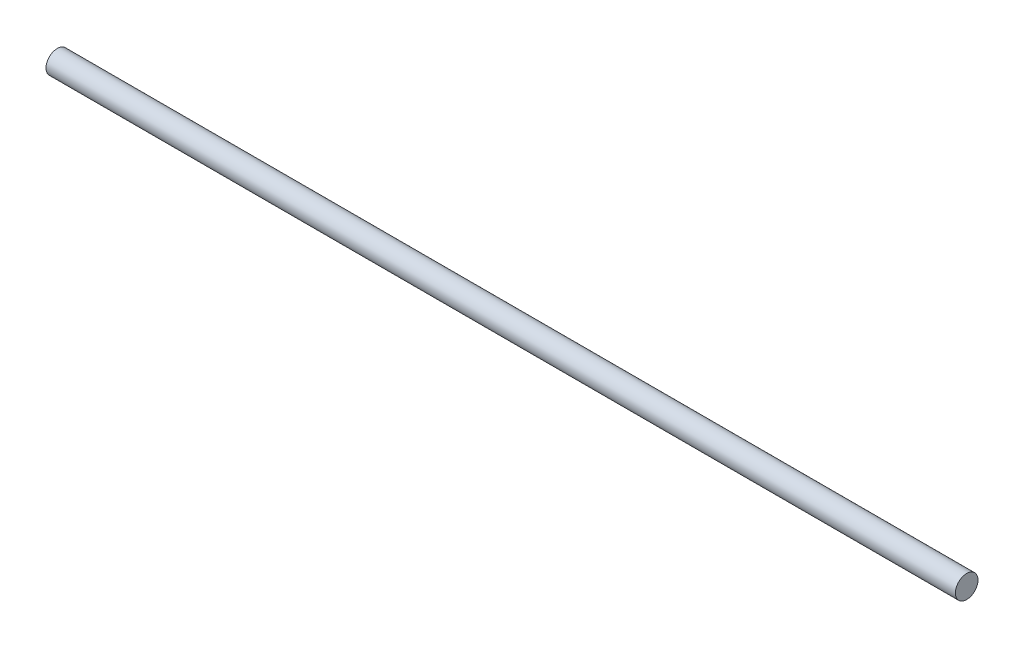
ISO-10303-21;
HEADER;
FILE_DESCRIPTION(('STEP AP214'),'2;1');
FILE_NAME('part.step','',(''),(''),'','','');
FILE_SCHEMA(('AUTOMOTIVE_DESIGN { 1 0 10303 214 1 1 1 1 }'));
ENDSEC;
DATA;
#1=APPLICATION_CONTEXT('core data for automotive mechanical design processes');
#2=APPLICATION_PROTOCOL_DEFINITION('international standard','automotive_design',2000,#1);
#3=PRODUCT_CONTEXT('',#1,'mechanical');
#4=PRODUCT('Part','Part','',(#3));
#5=PRODUCT_RELATED_PRODUCT_CATEGORY('part','',(#4));
#6=PRODUCT_DEFINITION_FORMATION('','',#4);
#7=PRODUCT_DEFINITION_CONTEXT('part definition',#1,'design');
#8=PRODUCT_DEFINITION('design','',#6,#7);
#9=PRODUCT_DEFINITION_SHAPE('','',#8);
#10=(LENGTH_UNIT() NAMED_UNIT(*) SI_UNIT(.MILLI.,.METRE.));
#11=(NAMED_UNIT(*) PLANE_ANGLE_UNIT() SI_UNIT($,.RADIAN.));
#12=(NAMED_UNIT(*) SI_UNIT($,.STERADIAN.) SOLID_ANGLE_UNIT());
#13=UNCERTAINTY_MEASURE_WITH_UNIT(LENGTH_MEASURE(1.E-05),#10,'distance_accuracy_value','');
#14=(GEOMETRIC_REPRESENTATION_CONTEXT(3) GLOBAL_UNCERTAINTY_ASSIGNED_CONTEXT((#13)) GLOBAL_UNIT_ASSIGNED_CONTEXT((#10,
#11,#12)) REPRESENTATION_CONTEXT('',''));
#15=CARTESIAN_POINT('',(0.,0.,0.));
#16=DIRECTION('',(0.,0.,1.));
#17=DIRECTION('',(1.,0.,0.));
#18=AXIS2_PLACEMENT_3D('',#15,#16,#17);
#19=CARTESIAN_POINT('',(357.378,0.,0.));
#20=DIRECTION('',(-1.,0.,0.));
#21=DIRECTION('',(0.,0.,1.));
#22=AXIS2_PLACEMENT_3D('',#19,#20,#21);
#23=CYLINDRICAL_SURFACE('',#22,4.445);
#24=CARTESIAN_POINT('',(357.378,0.,0.));
#25=DIRECTION('',(1.,0.,0.));
#26=DIRECTION('',(0.,0.,-1.));
#27=AXIS2_PLACEMENT_3D('',#24,#25,#26);
#28=CIRCLE('',#27,4.445);
#29=CARTESIAN_POINT('',(357.378,0.,-4.445));
#30=VERTEX_POINT('',#29);
#31=EDGE_CURVE('E10',#30,#30,#28,.T.);
#32=ORIENTED_EDGE('',*,*,#31,.F.);
#33=EDGE_LOOP('',(#32));
#34=FACE_BOUND('',#33,.T.);
#35=CARTESIAN_POINT('',(0.,0.,0.));
#36=DIRECTION('',(1.,0.,0.));
#37=DIRECTION('',(0.,0.,-1.));
#38=AXIS2_PLACEMENT_3D('',#35,#36,#37);
#39=CIRCLE('',#38,4.445);
#40=CARTESIAN_POINT('',(0.,0.,-4.445));
#41=VERTEX_POINT('',#40);
#42=EDGE_CURVE('E34',#41,#41,#39,.T.);
#43=ORIENTED_EDGE('',*,*,#42,.T.);
#44=EDGE_LOOP('',(#43));
#45=FACE_BOUND('',#44,.T.);
#46=ADVANCED_FACE('F31',(#34,#45),#23,.T.);
#47=CARTESIAN_POINT('',(357.378,0.,0.));
#48=DIRECTION('',(1.,0.,0.));
#49=DIRECTION('',(0.,0.,-1.));
#50=AXIS2_PLACEMENT_3D('',#47,#48,#49);
#51=PLANE('',#50);
#52=ORIENTED_EDGE('',*,*,#31,.T.);
#53=EDGE_LOOP('',(#52));
#54=FACE_BOUND('',#53,.T.);
#55=ADVANCED_FACE('F46',(#54),#51,.T.);
#56=CARTESIAN_POINT('',(0.,0.,0.));
#57=DIRECTION('',(1.,0.,0.));
#58=DIRECTION('',(0.,0.,-1.));
#59=AXIS2_PLACEMENT_3D('',#56,#57,#58);
#60=PLANE('',#59);
#61=ORIENTED_EDGE('',*,*,#42,.F.);
#62=EDGE_LOOP('',(#61));
#63=FACE_BOUND('',#62,.T.);
#64=ADVANCED_FACE('F44',(#63),#60,.F.);
#65=CLOSED_SHELL('',(#46,#55,#64));
#66=MANIFOLD_SOLID_BREP('B2',#65);
#67=ADVANCED_BREP_SHAPE_REPRESENTATION('',(#18,#66),#14);
#68=SHAPE_DEFINITION_REPRESENTATION(#9,#67);
ENDSEC;
END-ISO-10303-21;
